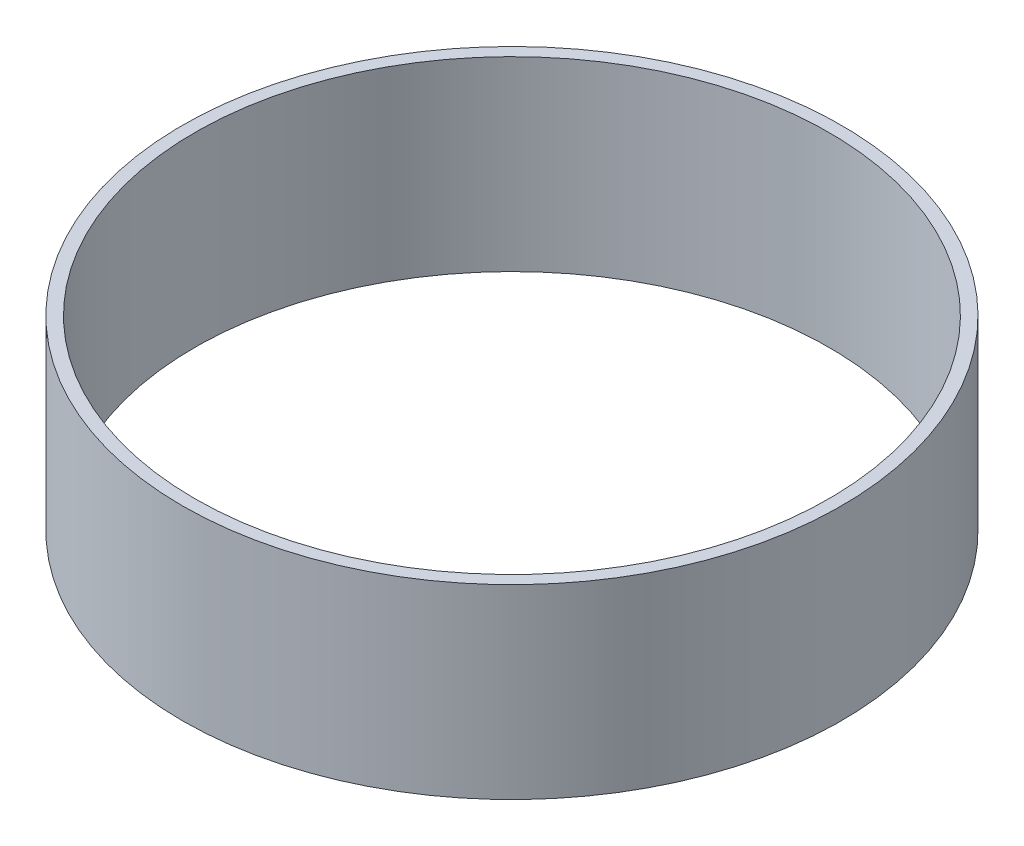
ISO-10303-21;
HEADER;
FILE_DESCRIPTION(('STEP AP214'),'2;1');
FILE_NAME('part.step','',(''),(''),'','','');
FILE_SCHEMA(('AUTOMOTIVE_DESIGN { 1 0 10303 214 1 1 1 1 }'));
ENDSEC;
DATA;
#1=APPLICATION_CONTEXT('core data for automotive mechanical design processes');
#2=APPLICATION_PROTOCOL_DEFINITION('international standard','automotive_design',2000,#1);
#3=PRODUCT_CONTEXT('',#1,'mechanical');
#4=PRODUCT('Part','Part','',(#3));
#5=PRODUCT_RELATED_PRODUCT_CATEGORY('part','',(#4));
#6=PRODUCT_DEFINITION_FORMATION('','',#4);
#7=PRODUCT_DEFINITION_CONTEXT('part definition',#1,'design');
#8=PRODUCT_DEFINITION('design','',#6,#7);
#9=PRODUCT_DEFINITION_SHAPE('','',#8);
#10=(LENGTH_UNIT() NAMED_UNIT(*) SI_UNIT(.MILLI.,.METRE.));
#11=(NAMED_UNIT(*) PLANE_ANGLE_UNIT() SI_UNIT($,.RADIAN.));
#12=(NAMED_UNIT(*) SI_UNIT($,.STERADIAN.) SOLID_ANGLE_UNIT());
#13=UNCERTAINTY_MEASURE_WITH_UNIT(LENGTH_MEASURE(1.E-05),#10,'distance_accuracy_value','');
#14=(GEOMETRIC_REPRESENTATION_CONTEXT(3) GLOBAL_UNCERTAINTY_ASSIGNED_CONTEXT((#13)) GLOBAL_UNIT_ASSIGNED_CONTEXT((#10,
#11,#12)) REPRESENTATION_CONTEXT('',''));
#15=CARTESIAN_POINT('',(0.,0.,0.));
#16=DIRECTION('',(0.,0.,1.));
#17=DIRECTION('',(1.,0.,0.));
#18=AXIS2_PLACEMENT_3D('',#15,#16,#17);
#19=CARTESIAN_POINT('',(-29.3796636543625,14.97,-2.74208117883447));
#20=DIRECTION('',(0.,1.,0.));
#21=DIRECTION('',(0.,0.,1.));
#22=AXIS2_PLACEMENT_3D('',#19,#20,#21);
#23=PLANE('',#22);
#24=CARTESIAN_POINT('',(-29.3796636543625,14.97,-2.74208117883447));
#25=DIRECTION('',(0.,1.,0.));
#26=DIRECTION('',(0.,0.,1.));
#27=AXIS2_PLACEMENT_3D('',#24,#25,#26);
#28=CIRCLE('',#27,26.506);
#29=CARTESIAN_POINT('',(-29.3796636543625,14.97,23.7639188211655));
#30=VERTEX_POINT('',#29);
#31=EDGE_CURVE('E10',#30,#30,#28,.T.);
#32=ORIENTED_EDGE('',*,*,#31,.T.);
#33=EDGE_LOOP('',(#32));
#34=FACE_BOUND('',#33,.T.);
#35=CARTESIAN_POINT('',(-29.3796636543625,14.97,-2.74208117883447));
#36=DIRECTION('',(0.,1.,0.));
#37=DIRECTION('',(0.,0.,1.));
#38=AXIS2_PLACEMENT_3D('',#35,#36,#37);
#39=CIRCLE('',#38,25.506);
#40=CARTESIAN_POINT('',(-29.3796636543625,14.97,22.7639188211655));
#41=VERTEX_POINT('',#40);
#42=EDGE_CURVE('E41',#41,#41,#39,.T.);
#43=ORIENTED_EDGE('',*,*,#42,.F.);
#44=EDGE_LOOP('',(#43));
#45=FACE_BOUND('',#44,.T.);
#46=ADVANCED_FACE('F30',(#34,#45),#23,.T.);
#47=CARTESIAN_POINT('',(-29.3796636543625,0.,-2.74208117883447));
#48=DIRECTION('',(0.,1.,0.));
#49=DIRECTION('',(0.,0.,1.));
#50=AXIS2_PLACEMENT_3D('',#47,#48,#49);
#51=PLANE('',#50);
#52=CARTESIAN_POINT('',(-29.3796636543625,0.,-2.74208117883447));
#53=DIRECTION('',(0.,1.,0.));
#54=DIRECTION('',(0.,0.,1.));
#55=AXIS2_PLACEMENT_3D('',#52,#53,#54);
#56=CIRCLE('',#55,26.506);
#57=CARTESIAN_POINT('',(-29.3796636543625,0.,23.7639188211655));
#58=VERTEX_POINT('',#57);
#59=EDGE_CURVE('E34',#58,#58,#56,.T.);
#60=ORIENTED_EDGE('',*,*,#59,.F.);
#61=EDGE_LOOP('',(#60));
#62=FACE_BOUND('',#61,.T.);
#63=CARTESIAN_POINT('',(-29.3796636543625,0.,-2.74208117883447));
#64=DIRECTION('',(0.,1.,0.));
#65=DIRECTION('',(0.,0.,1.));
#66=AXIS2_PLACEMENT_3D('',#63,#64,#65);
#67=CIRCLE('',#66,25.506);
#68=CARTESIAN_POINT('',(-29.3796636543625,0.,22.7639188211655));
#69=VERTEX_POINT('',#68);
#70=EDGE_CURVE('E43',#69,#69,#67,.T.);
#71=ORIENTED_EDGE('',*,*,#70,.T.);
#72=EDGE_LOOP('',(#71));
#73=FACE_BOUND('',#72,.T.);
#74=ADVANCED_FACE('F53',(#62,#73),#51,.F.);
#75=CARTESIAN_POINT('',(-29.3796636543625,14.97,-2.74208117883447));
#76=DIRECTION('',(0.,-1.,0.));
#77=DIRECTION('',(0.,0.,-1.));
#78=AXIS2_PLACEMENT_3D('',#75,#76,#77);
#79=CYLINDRICAL_SURFACE('',#78,26.506);
#80=ORIENTED_EDGE('',*,*,#31,.F.);
#81=EDGE_LOOP('',(#80));
#82=FACE_BOUND('',#81,.T.);
#83=ORIENTED_EDGE('',*,*,#59,.T.);
#84=EDGE_LOOP('',(#83));
#85=FACE_BOUND('',#84,.T.);
#86=ADVANCED_FACE('F32',(#82,#85),#79,.T.);
#87=CARTESIAN_POINT('',(-29.3796636543625,14.97,-2.74208117883447));
#88=DIRECTION('',(0.,-1.,0.));
#89=DIRECTION('',(0.,0.,-1.));
#90=AXIS2_PLACEMENT_3D('',#87,#88,#89);
#91=CYLINDRICAL_SURFACE('',#90,25.506);
#92=ORIENTED_EDGE('',*,*,#42,.T.);
#93=EDGE_LOOP('',(#92));
#94=FACE_BOUND('',#93,.T.);
#95=ORIENTED_EDGE('',*,*,#70,.F.);
#96=EDGE_LOOP('',(#95));
#97=FACE_BOUND('',#96,.T.);
#98=ADVANCED_FACE('F49',(#94,#97),#91,.F.);
#99=CLOSED_SHELL('',(#46,#74,#86,#98));
#100=MANIFOLD_SOLID_BREP('B2',#99);
#101=ADVANCED_BREP_SHAPE_REPRESENTATION('',(#18,#100),#14);
#102=SHAPE_DEFINITION_REPRESENTATION(#9,#101);
ENDSEC;
END-ISO-10303-21;
